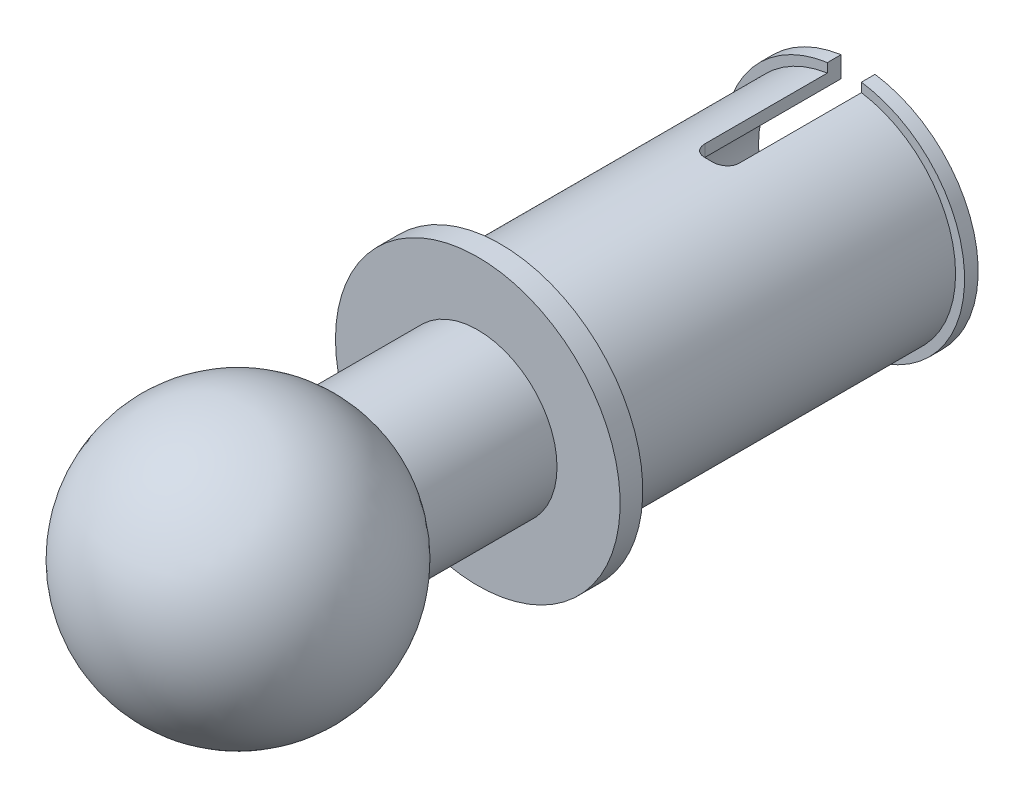
ISO-10303-21;
HEADER;
FILE_DESCRIPTION(('STEP AP214'),'2;1');
FILE_NAME('part.step','',(''),(''),'','','');
FILE_SCHEMA(('AUTOMOTIVE_DESIGN { 1 0 10303 214 1 1 1 1 }'));
ENDSEC;
DATA;
#1=APPLICATION_CONTEXT('core data for automotive mechanical design processes');
#2=APPLICATION_PROTOCOL_DEFINITION('international standard','automotive_design',2000,#1);
#3=PRODUCT_CONTEXT('',#1,'mechanical');
#4=PRODUCT('Part','Part','',(#3));
#5=PRODUCT_RELATED_PRODUCT_CATEGORY('part','',(#4));
#6=PRODUCT_DEFINITION_FORMATION('','',#4);
#7=PRODUCT_DEFINITION_CONTEXT('part definition',#1,'design');
#8=PRODUCT_DEFINITION('design','',#6,#7);
#9=PRODUCT_DEFINITION_SHAPE('','',#8);
#10=(LENGTH_UNIT() NAMED_UNIT(*) SI_UNIT(.MILLI.,.METRE.));
#11=(NAMED_UNIT(*) PLANE_ANGLE_UNIT() SI_UNIT($,.RADIAN.));
#12=(NAMED_UNIT(*) SI_UNIT($,.STERADIAN.) SOLID_ANGLE_UNIT());
#13=UNCERTAINTY_MEASURE_WITH_UNIT(LENGTH_MEASURE(1.E-05),#10,'distance_accuracy_value','');
#14=(GEOMETRIC_REPRESENTATION_CONTEXT(3) GLOBAL_UNCERTAINTY_ASSIGNED_CONTEXT((#13)) GLOBAL_UNIT_ASSIGNED_CONTEXT((#10,
#11,#12)) REPRESENTATION_CONTEXT('',''));
#15=CARTESIAN_POINT('',(0.,0.,0.));
#16=DIRECTION('',(0.,0.,1.));
#17=DIRECTION('',(1.,0.,0.));
#18=AXIS2_PLACEMENT_3D('',#15,#16,#17);
#19=CARTESIAN_POINT('',(0.,0.,3.));
#20=DIRECTION('',(0.,0.,-1.));
#21=DIRECTION('',(-1.,0.,0.));
#22=AXIS2_PLACEMENT_3D('',#19,#20,#21);
#23=CYLINDRICAL_SURFACE('',#22,1.75);
#24=CARTESIAN_POINT('',(0.,0.,0.));
#25=DIRECTION('',(0.,0.,1.));
#26=DIRECTION('',(1.,0.,0.));
#27=AXIS2_PLACEMENT_3D('',#24,#25,#26);
#28=CIRCLE('',#27,1.75);
#29=CARTESIAN_POINT('',(1.75,0.,0.));
#30=VERTEX_POINT('',#29);
#31=EDGE_CURVE('E50',#30,#30,#28,.T.);
#32=ORIENTED_EDGE('',*,*,#31,.T.);
#33=EDGE_LOOP('',(#32));
#34=FACE_BOUND('',#33,.T.);
#35=CARTESIAN_POINT('',(-1.23781172843719,-1.23706414112129,2.86587107800594));
#36=CARTESIAN_POINT('',(-1.16832295713658,-1.30658930635751,2.86613151653475));
#37=CARTESIAN_POINT('',(-1.09291087371414,-1.37029557879855,2.86637113637438));
#38=CARTESIAN_POINT('',(-0.932398448924122,-1.48419600156255,2.86679881320044));
#39=CARTESIAN_POINT('',(-0.847286539995932,-1.53437377337958,2.86698680769084));
#40=CARTESIAN_POINT('',(-0.669877838471443,-1.61970489632098,2.86730672753367));
#41=CARTESIAN_POINT('',(-0.577584495376744,-1.65486540875062,2.86743867961097));
#42=CARTESIAN_POINT('',(-0.388430053675515,-1.70918213712148,2.86764248770364));
#43=CARTESIAN_POINT('',(-0.291570098913812,-1.72834233855625,2.86771435868453));
#44=CARTESIAN_POINT('',(-0.0959978121947807,-1.75013306228772,2.86779610263345));
#45=CARTESIAN_POINT('',(0.00271470573638223,-1.75276191604778,2.86780596934329));
#46=CARTESIAN_POINT('',(0.199183795320416,-1.74140994510881,2.86776338115849));
#47=CARTESIAN_POINT('',(0.296940329011406,-1.72742846349632,2.86771092379904));
#48=CARTESIAN_POINT('',(0.488716547356107,-1.6832523003135,2.86754519083015));
#49=CARTESIAN_POINT('',(0.582736308214581,-1.65305794955787,2.86743191646167));
#50=CARTESIAN_POINT('',(0.764371933899558,-1.57731345076565,2.86714779129308));
#51=CARTESIAN_POINT('',(0.851987812222137,-1.53176333509222,2.86697694061432));
#52=CARTESIAN_POINT('',(1.01832919408176,-1.42660011383197,2.86658254531724));
#53=CARTESIAN_POINT('',(1.0970546549465,-1.36698694074939,2.86635900044602));
#54=CARTESIAN_POINT('',(1.24337985140612,-1.23539011138467,2.86586560634556));
#55=CARTESIAN_POINT('',(1.31097960636011,-1.16340647662801,2.86559575719691));
#56=CARTESIAN_POINT('',(1.43313507715094,-1.00911155637872,2.86501745304013));
#57=CARTESIAN_POINT('',(1.48769070831325,-0.92680020385011,2.86470899778142));
#58=CARTESIAN_POINT('',(1.58220880459615,-0.754186702892072,2.8640622795952));
#59=CARTESIAN_POINT('',(1.62217125388076,-0.663884545791449,2.86372401663534));
#60=CARTESIAN_POINT('',(1.68636875101415,-0.477852304805216,2.86302731257977));
#61=CARTESIAN_POINT('',(1.71060369856923,-0.38212218630993,2.86266887135541));
#62=CARTESIAN_POINT('',(1.74265785294353,-0.187952069242505,2.86194200987976));
#63=CARTESIAN_POINT('',(1.75047706589844,-0.089512071683247,2.8615735896322));
#64=CARTESIAN_POINT('',(1.74947781418076,0.107283886729034,2.86083723106276));
#65=CARTESIAN_POINT('',(1.74065927528938,0.205639847205221,2.86046929274304));
#66=CARTESIAN_POINT('',(1.70663469179721,0.399475269519153,2.85974433854194));
#67=CARTESIAN_POINT('',(1.68142864493993,0.494954730960815,2.85938732266207));
#68=CARTESIAN_POINT('',(1.61534454060295,0.680326751529844,2.85869432501763));
#69=CARTESIAN_POINT('',(1.57446648278764,0.770219310537567,2.85835834325353));
#70=CARTESIAN_POINT('',(1.47819873255001,0.941865699929958,2.85771692154179));
#71=CARTESIAN_POINT('',(1.42280904103219,1.02361953082191,2.85741148159224));
#72=CARTESIAN_POINT('',(1.29909060745432,1.17666733764984,2.85683977420972));
#73=CARTESIAN_POINT('',(1.23076191982931,1.24796135758857,2.85657350661195));
#74=CARTESIAN_POINT('',(1.08310496755828,1.37806606562148,2.85608766101448));
#75=CARTESIAN_POINT('',(1.00377670279522,1.43687675358284,2.85586808301528));
#76=CARTESIAN_POINT('',(0.836373052907074,1.54034491713454,2.85548180908152));
#77=CARTESIAN_POINT('',(0.748297725357388,1.5850024858762,2.85531511279889));
#78=CARTESIAN_POINT('',(0.565899730405491,1.65889718076986,2.85503930062829));
#79=CARTESIAN_POINT('',(0.471577064048076,1.68813430950074,2.85493018473069));
#80=CARTESIAN_POINT('',(0.279362560172519,1.73035800155919,2.85477260568945));
#81=CARTESIAN_POINT('',(0.181470745086311,1.74334466700205,2.85472414216467));
#82=CARTESIAN_POINT('',(-0.0151037822444458,1.75269910184221,2.85468923343177));
#83=CARTESIAN_POINT('',(-0.113786494791717,1.74906686487819,2.85470278824738));
#84=CARTESIAN_POINT('',(-0.309141185874032,1.72528662561853,2.85479153244129));
#85=CARTESIAN_POINT('',(-0.405813169768018,1.70513866734595,2.8548667216553));
#86=CARTESIAN_POINT('',(-0.594402347357204,1.64889903657181,2.85507661858788));
#87=CARTESIAN_POINT('',(-0.686319546080037,1.61280738092924,2.85521132624352));
#88=CARTESIAN_POINT('',(-0.862790130887985,1.5257048794776,2.85553646276093));
#89=CARTESIAN_POINT('',(-0.947343508981962,1.47469401747863,2.85572689168316));
#90=CARTESIAN_POINT('',(-1.10668631423175,1.35920109090994,2.85615810445742));
#91=CARTESIAN_POINT('',(-1.18147572344309,1.29471900158302,2.85639888840198));
#92=CARTESIAN_POINT('',(-1.31916765907599,1.15411391910872,2.85692401638699));
#93=CARTESIAN_POINT('',(-1.38207014519017,1.07799088648965,2.85720836057515));
#94=CARTESIAN_POINT('',(-1.4942024714582,0.916264822971578,2.8578125807027));
#95=CARTESIAN_POINT('',(-1.54343228418751,0.830661773058115,2.85813245671337));
#96=CARTESIAN_POINT('',(-1.62682277665568,0.652403582618012,2.85879870269929));
#97=CARTESIAN_POINT('',(-1.66098307387097,0.559748263147032,2.85914507334682));
#98=CARTESIAN_POINT('',(-1.71326182172136,0.370021269907531,2.85985448485442));
#99=CARTESIAN_POINT('',(-1.7313808994164,0.272949768925906,2.86021752506229));
#100=CARTESIAN_POINT('',(-1.75106480437168,0.0771529590822092,2.86094995961711));
#101=CARTESIAN_POINT('',(-1.75263127297451,-0.0215721848336674,2.86131935333041));
#102=CARTESIAN_POINT('',(-1.73916594381052,-0.217911001767462,2.86205414268293));
#103=CARTESIAN_POINT('',(-1.72413002626857,-0.31552439283729,2.86241953730708));
#104=CARTESIAN_POINT('',(-1.67787712307839,-0.506879013151351,2.86313601207493));
#105=CARTESIAN_POINT('',(-1.64665239163721,-0.600618365598762,2.86348708527951));
#106=CARTESIAN_POINT('',(-1.56892156096071,-0.781439590521581,2.86416434695263));
#107=CARTESIAN_POINT('',(-1.52243387904025,-0.868529331527148,2.86449056483165));
#108=CARTESIAN_POINT('',(-1.43563490174034,-1.00261406444327,2.86499317321039));
#109=CARTESIAN_POINT('',(-1.39954739134343,-1.05239530653383,2.86517986599321));
#110=CARTESIAN_POINT('',(-1.32234822555369,-1.14789654926951,2.86553744190864));
#111=CARTESIAN_POINT('',(-1.28123657360354,-1.19361655269744,2.86570832505209));
#112=CARTESIAN_POINT('',(-1.23781172843719,-1.23706414112129,2.86587107800594));
#113=B_SPLINE_CURVE_WITH_KNOTS('',3,(#35,#36,#37,#38,#39,#40,#41,#42,#43,#44,#45,#46,#47,#48,
#49,#50,#51,#52,#53,#54,#55,#56,#57,#58,#59,#60,#61,#62,#63,#64,#65,#66,#67,#68,#69,#70,#71,#72,
#73,#74,#75,#76,#77,#78,#79,#80,#81,#82,#83,#84,#85,#86,#87,#88,#89,#90,#91,#92,#93,#94,#95,#96,
#97,#98,#99,#100,#101,#102,#103,#104,#105,#106,#107,#108,#109,#110,#111,#112),.UNSPECIFIED.,.T.,
.F.,(4,2,2,2,2,2,2,2,2,2,2,2,2,2,2,2,2,2,2,2,2,2,2,2,2,2,2,2,2,2,2,2,2,2,2,2,2,2,4),(0.,
0.294670094103354,0.589695349671734,0.884579758550254,1.17939069318408,1.47423138310229,
1.76908373390866,2.063930068643,2.35877578197563,2.65362291045125,2.94846952587726,
3.24331805521642,3.53816690451331,3.83301763403201,4.12786825334477,4.42272018794983,
4.71757216315458,5.01242414467357,5.30727610781466,5.60212683052535,5.89697755637323,
6.19182634156722,6.48667507745128,6.78152196054404,7.07636895649723,7.37121516653095,
7.6660610647926,7.96090728301378,8.25575404310314,8.55060180297047,8.84545015423684,
9.14030598948322,9.43515029814664,9.72996537002543,10.0248536148079,10.3198830839027,
10.6145578507821,10.7987028822767,10.9828477875915),.UNSPECIFIED.);
#114=CARTESIAN_POINT('',(-1.23781172843719,-1.23706414112129,2.86587107800594));
#115=VERTEX_POINT('',#114);
#116=EDGE_CURVE('E11',#115,#115,#113,.T.);
#117=ORIENTED_EDGE('',*,*,#116,.F.);
#118=EDGE_LOOP('',(#117));
#119=FACE_BOUND('',#118,.T.);
#120=ADVANCED_FACE('F36',(#34,#119),#23,.T.);
#121=CARTESIAN_POINT('',(0.,0.,-8.4));
#122=DIRECTION('',(0.,0.,1.));
#123=DIRECTION('',(1.,0.,0.));
#124=AXIS2_PLACEMENT_3D('',#121,#122,#123);
#125=CYLINDRICAL_SURFACE('',#124,2.45588838636761);
#126=CARTESIAN_POINT('',(0.,0.,-0.5));
#127=DIRECTION('',(0.,0.,-1.));
#128=DIRECTION('',(-1.,0.,0.));
#129=AXIS2_PLACEMENT_3D('',#126,#127,#128);
#130=CIRCLE('',#129,2.45588838636761);
#131=CARTESIAN_POINT('',(-2.45588838636761,0.,-0.5));
#132=VERTEX_POINT('',#131);
#133=EDGE_CURVE('E191',#132,#132,#130,.T.);
#134=ORIENTED_EDGE('',*,*,#133,.T.);
#135=EDGE_LOOP('',(#134));
#136=FACE_BOUND('',#135,.T.);
#137=DIRECTION('',(0.,0.,1.));
#138=VECTOR('',#137,1.);
#139=CARTESIAN_POINT('',(-0.375484043586889,2.4270145239176,-8.4));
#140=LINE('',#139,#138);
#141=CARTESIAN_POINT('',(-0.375484043586889,2.4270145239176,-8.1));
#142=VERTEX_POINT('',#141);
#143=CARTESIAN_POINT('',(-0.375484043586889,2.4270145239176,-5.4));
#144=VERTEX_POINT('',#143);
#145=EDGE_CURVE('E359',#142,#144,#140,.T.);
#146=ORIENTED_EDGE('',*,*,#145,.F.);
#147=CARTESIAN_POINT('',(0.,0.,-8.1));
#148=DIRECTION('',(0.,0.,-1.));
#149=DIRECTION('',(-1.,0.,0.));
#150=AXIS2_PLACEMENT_3D('',#147,#148,#149);
#151=CIRCLE('',#150,2.45588838636761);
#152=CARTESIAN_POINT('',(-0.375484043586889,-2.4270145239176,-8.1));
#153=VERTEX_POINT('',#152);
#154=EDGE_CURVE('E194',#153,#142,#151,.T.);
#155=ORIENTED_EDGE('',*,*,#154,.F.);
#156=DIRECTION('',(0.,0.,1.));
#157=VECTOR('',#156,1.);
#158=CARTESIAN_POINT('',(-0.375484043586889,-2.4270145239176,-8.4));
#159=LINE('',#158,#157);
#160=CARTESIAN_POINT('',(-0.375484043586889,-2.4270145239176,-5.4));
#161=VERTEX_POINT('',#160);
#162=EDGE_CURVE('E344',#153,#161,#159,.T.);
#163=ORIENTED_EDGE('',*,*,#162,.T.);
#164=CARTESIAN_POINT('',(-0.375484043586889,-2.4270145239176,-5.4));
#165=CARTESIAN_POINT('',(-0.37549888169311,-2.42700727901654,-5.38323395709811));
#166=CARTESIAN_POINT('',(-0.374079480575116,-2.42723175515793,-5.36647423344671));
#167=CARTESIAN_POINT('',(-0.368484254202977,-2.42809008269441,-5.33345281186828));
#168=CARTESIAN_POINT('',(-0.364311881065487,-2.42872342137082,-5.31719051687422));
#169=CARTESIAN_POINT('',(-0.353320653464955,-2.4303458937768,-5.28560044550802));
#170=CARTESIAN_POINT('',(-0.346501028074678,-2.43133513114431,-5.27027294287008));
#171=CARTESIAN_POINT('',(-0.330419021984758,-2.43357291697825,-5.24098057187997));
#172=CARTESIAN_POINT('',(-0.32115667535512,-2.43482146182792,-5.22701568452637));
#173=CARTESIAN_POINT('',(-0.300375628953651,-2.4374725214059,-5.20073529663856));
#174=CARTESIAN_POINT('',(-0.288841538802671,-2.43887605593803,-5.18843206927226));
#175=CARTESIAN_POINT('',(-0.26387707030476,-2.44170313144287,-5.16592623819471));
#176=CARTESIAN_POINT('',(-0.250446291835951,-2.44312667657978,-5.15572407884016));
#177=CARTESIAN_POINT('',(-0.221959344739332,-2.44587976511667,-5.13764201250059));
#178=CARTESIAN_POINT('',(-0.206892273115667,-2.44720856617525,-5.12977917621617));
#179=CARTESIAN_POINT('',(-0.175636753863135,-2.44964987678169,-5.11670521278166));
#180=CARTESIAN_POINT('',(-0.159449021207576,-2.45076252254123,-5.11149241232325));
#181=CARTESIAN_POINT('',(-0.131887716717742,-2.45236950134714,-5.10513138616619));
#182=CARTESIAN_POINT('',(-0.120691498040775,-2.45294664732856,-5.1032091884432));
#183=CARTESIAN_POINT('',(-0.0981607316683699,-2.45395204366317,-5.10064339449119));
#184=CARTESIAN_POINT('',(-0.0868263672836446,-2.45438047292502,-5.09999825751019));
#185=CARTESIAN_POINT('',(-0.0754840435868893,-2.45472807566522,-5.1));
#186=B_SPLINE_CURVE_WITH_KNOTS('',3,(#164,#165,#166,#167,#168,#169,#170,#171,#172,#173,#174,
#175,#176,#177,#178,#179,#180,#181,#182,#183,#184,#185),.UNSPECIFIED.,.F.,.F.,(4,2,2,2,2,2,2,2,
2,2,4),(0.,0.0502272334882759,0.100391603431723,0.150570593110447,0.2007488829516,
0.251279595061836,0.301820983006515,0.352722616251689,0.403592068705982,0.437647065288577,
0.471660949996417),.UNSPECIFIED.);
#187=CARTESIAN_POINT('',(-0.0754840435868895,-2.45472807566522,-5.1));
#188=VERTEX_POINT('',#187);
#189=EDGE_CURVE('E231',#161,#188,#186,.T.);
#190=ORIENTED_EDGE('',*,*,#189,.T.);
#191=CARTESIAN_POINT('',(0.,0.,-5.1));
#192=DIRECTION('',(0.,0.,-1.));
#193=DIRECTION('',(-1.,0.,0.));
#194=AXIS2_PLACEMENT_3D('',#191,#192,#193);
#195=CIRCLE('',#194,2.45588838636761);
#196=CARTESIAN_POINT('',(0.0754840435868895,-2.45472807566522,-5.1));
#197=VERTEX_POINT('',#196);
#198=EDGE_CURVE('E321',#197,#188,#195,.T.);
#199=ORIENTED_EDGE('',*,*,#198,.F.);
#200=CARTESIAN_POINT('',(0.0754840435868895,-2.45472807566522,-5.1));
#201=CARTESIAN_POINT('',(0.0923420988839594,-2.45421630633497,-5.09998562797421));
#202=CARTESIAN_POINT('',(0.109187924016877,-2.45351803612839,-5.10142003308527));
#203=CARTESIAN_POINT('',(0.142371089634653,-2.45181265088135,-5.10707217215756));
#204=CARTESIAN_POINT('',(0.158708987042475,-2.45080588826574,-5.11128673633791));
#205=CARTESIAN_POINT('',(0.190437262866639,-2.44854590180302,-5.12238701827945));
#206=CARTESIAN_POINT('',(0.205827371164301,-2.44729260811778,-5.12927349348699));
#207=CARTESIAN_POINT('',(0.235230006652533,-2.44464151410403,-5.14551397480055));
#208=CARTESIAN_POINT('',(0.24924257828844,-2.44324371844078,-5.15486790125994));
#209=CARTESIAN_POINT('',(0.275582178616159,-2.44041372767217,-5.1758441270666));
#210=CARTESIAN_POINT('',(0.287899054638753,-2.43898138100939,-5.18747915737625));
#211=CARTESIAN_POINT('',(0.310409816539773,-2.43621887744776,-5.21266308922253));
#212=CARTESIAN_POINT('',(0.320603316459189,-2.43488873915467,-5.22621233795046));
#213=CARTESIAN_POINT('',(0.338588357530534,-2.43245318466727,-5.25486951128836));
#214=CARTESIAN_POINT('',(0.346375947157327,-2.43134813917403,-5.26997994629307));
#215=CARTESIAN_POINT('',(0.359292591821828,-2.42947308607119,-5.3013119223987));
#216=CARTESIAN_POINT('',(0.36442346713599,-2.42870284912214,-5.3175326940902));
#217=CARTESIAN_POINT('',(0.370585562803578,-2.42776855612038,-5.3448799334876));
#218=CARTESIAN_POINT('',(0.372420949037788,-2.42748698007668,-5.35582788993223));
#219=CARTESIAN_POINT('',(0.374870230998934,-2.42710949830464,-5.3778488965225));
#220=CARTESIAN_POINT('',(0.37548564181925,-2.42701336228145,-5.38892177430955));
#221=CARTESIAN_POINT('',(0.375484043586889,-2.4270145239176,-5.4));
#222=B_SPLINE_CURVE_WITH_KNOTS('',3,(#200,#201,#202,#203,#204,#205,#206,#207,#208,#209,#210,
#211,#212,#213,#214,#215,#216,#217,#218,#219,#220,#221),.UNSPECIFIED.,.F.,.F.,(4,2,2,2,2,2,2,2,
2,2,4),(0.,0.0505260721160713,0.100994636586164,0.151477518596309,0.201958771273612,
0.252730222994284,0.303510895235536,0.354374532842476,0.405203274410755,0.438451454147828,
0.471658316876831),.UNSPECIFIED.);
#223=CARTESIAN_POINT('',(0.375484043586889,-2.4270145239176,-5.4));
#224=VERTEX_POINT('',#223);
#225=EDGE_CURVE('E265',#197,#224,#222,.T.);
#226=ORIENTED_EDGE('',*,*,#225,.T.);
#227=DIRECTION('',(0.,0.,1.));
#228=VECTOR('',#227,1.);
#229=CARTESIAN_POINT('',(0.375484043586889,-2.4270145239176,-8.4));
#230=LINE('',#229,#228);
#231=CARTESIAN_POINT('',(0.375484043586889,-2.4270145239176,-8.1));
#232=VERTEX_POINT('',#231);
#233=EDGE_CURVE('E349',#232,#224,#230,.T.);
#234=ORIENTED_EDGE('',*,*,#233,.F.);
#235=CARTESIAN_POINT('',(0.375484043586889,2.4270145239176,-8.1));
#236=VERTEX_POINT('',#235);
#237=EDGE_CURVE('E203',#236,#232,#151,.T.);
#238=ORIENTED_EDGE('',*,*,#237,.F.);
#239=DIRECTION('',(0.,0.,1.));
#240=VECTOR('',#239,1.);
#241=CARTESIAN_POINT('',(0.375484043586889,2.4270145239176,-8.4));
#242=LINE('',#241,#240);
#243=CARTESIAN_POINT('',(0.375484043586889,2.4270145239176,-5.4));
#244=VERTEX_POINT('',#243);
#245=EDGE_CURVE('E355',#236,#244,#242,.T.);
#246=ORIENTED_EDGE('',*,*,#245,.T.);
#247=CARTESIAN_POINT('',(0.375484043586889,2.4270145239176,-5.4));
#248=CARTESIAN_POINT('',(0.37549888169311,2.42700727901654,-5.38323395709811));
#249=CARTESIAN_POINT('',(0.374079480575116,2.42723175515793,-5.36647423344671));
#250=CARTESIAN_POINT('',(0.368484254202977,2.42809008269441,-5.33345281186828));
#251=CARTESIAN_POINT('',(0.364311881065487,2.42872342137082,-5.31719051687422));
#252=CARTESIAN_POINT('',(0.353320653464955,2.4303458937768,-5.28560044550802));
#253=CARTESIAN_POINT('',(0.346501028074678,2.43133513114431,-5.27027294287008));
#254=CARTESIAN_POINT('',(0.330419021984758,2.43357291697825,-5.24098057187997));
#255=CARTESIAN_POINT('',(0.32115667535512,2.43482146182792,-5.22701568452637));
#256=CARTESIAN_POINT('',(0.300375628953651,2.4374725214059,-5.20073529663856));
#257=CARTESIAN_POINT('',(0.288841538802671,2.43887605593803,-5.18843206927226));
#258=CARTESIAN_POINT('',(0.26387707030476,2.44170313144287,-5.16592623819471));
#259=CARTESIAN_POINT('',(0.250446291835951,2.44312667657978,-5.15572407884016));
#260=CARTESIAN_POINT('',(0.221959344739332,2.44587976511667,-5.13764201250059));
#261=CARTESIAN_POINT('',(0.206892273115667,2.44720856617525,-5.12977917621617));
#262=CARTESIAN_POINT('',(0.175636753863135,2.44964987678169,-5.11670521278166));
#263=CARTESIAN_POINT('',(0.159449021207576,2.45076252254123,-5.11149241232325));
#264=CARTESIAN_POINT('',(0.131887716717742,2.45236950134714,-5.10513138616619));
#265=CARTESIAN_POINT('',(0.120691498040775,2.45294664732856,-5.1032091884432));
#266=CARTESIAN_POINT('',(0.0981607316683699,2.45395204366317,-5.10064339449119));
#267=CARTESIAN_POINT('',(0.0868263672836446,2.45438047292502,-5.09999825751019));
#268=CARTESIAN_POINT('',(0.0754840435868893,2.45472807566522,-5.1));
#269=B_SPLINE_CURVE_WITH_KNOTS('',3,(#247,#248,#249,#250,#251,#252,#253,#254,#255,#256,#257,
#258,#259,#260,#261,#262,#263,#264,#265,#266,#267,#268),.UNSPECIFIED.,.F.,.F.,(4,2,2,2,2,2,2,2,
2,2,4),(0.,0.0502272334882759,0.100391603431723,0.150570593110447,0.2007488829516,
0.251279595061836,0.301820983006515,0.352722616251689,0.403592068705982,0.437647065288577,
0.471660949996417),.UNSPECIFIED.);
#270=CARTESIAN_POINT('',(0.0754840435868895,2.45472807566522,-5.1));
#271=VERTEX_POINT('',#270);
#272=EDGE_CURVE('E300',#244,#271,#269,.T.);
#273=ORIENTED_EDGE('',*,*,#272,.T.);
#274=CARTESIAN_POINT('',(0.,0.,-5.1));
#275=DIRECTION('',(0.,0.,-1.));
#276=DIRECTION('',(-1.,0.,0.));
#277=AXIS2_PLACEMENT_3D('',#274,#275,#276);
#278=CIRCLE('',#277,2.45588838636761);
#279=CARTESIAN_POINT('',(-0.0754840435868895,2.45472807566522,-5.1));
#280=VERTEX_POINT('',#279);
#281=EDGE_CURVE('E352',#280,#271,#278,.T.);
#282=ORIENTED_EDGE('',*,*,#281,.F.);
#283=CARTESIAN_POINT('',(-0.0754840435868895,2.45472807566522,-5.1));
#284=CARTESIAN_POINT('',(-0.0923420988839594,2.45421630633497,-5.09998562797421));
#285=CARTESIAN_POINT('',(-0.109187924016877,2.45351803612839,-5.10142003308527));
#286=CARTESIAN_POINT('',(-0.142371089634653,2.45181265088135,-5.10707217215756));
#287=CARTESIAN_POINT('',(-0.158708987042475,2.45080588826574,-5.11128673633791));
#288=CARTESIAN_POINT('',(-0.190437262866639,2.44854590180302,-5.12238701827945));
#289=CARTESIAN_POINT('',(-0.205827371164301,2.44729260811778,-5.12927349348699));
#290=CARTESIAN_POINT('',(-0.235230006652533,2.44464151410403,-5.14551397480055));
#291=CARTESIAN_POINT('',(-0.24924257828844,2.44324371844078,-5.15486790125994));
#292=CARTESIAN_POINT('',(-0.275582178616159,2.44041372767217,-5.1758441270666));
#293=CARTESIAN_POINT('',(-0.287899054638753,2.43898138100939,-5.18747915737625));
#294=CARTESIAN_POINT('',(-0.310409816539773,2.43621887744776,-5.21266308922253));
#295=CARTESIAN_POINT('',(-0.320603316459189,2.43488873915467,-5.22621233795046));
#296=CARTESIAN_POINT('',(-0.338588357530534,2.43245318466727,-5.25486951128836));
#297=CARTESIAN_POINT('',(-0.346375947157327,2.43134813917403,-5.26997994629307));
#298=CARTESIAN_POINT('',(-0.359292591821828,2.42947308607119,-5.3013119223987));
#299=CARTESIAN_POINT('',(-0.36442346713599,2.42870284912214,-5.3175326940902));
#300=CARTESIAN_POINT('',(-0.370585562803578,2.42776855612038,-5.3448799334876));
#301=CARTESIAN_POINT('',(-0.372420949037788,2.42748698007668,-5.35582788993223));
#302=CARTESIAN_POINT('',(-0.374870230998934,2.42710949830464,-5.3778488965225));
#303=CARTESIAN_POINT('',(-0.37548564181925,2.42701336228145,-5.38892177430955));
#304=CARTESIAN_POINT('',(-0.375484043586889,2.4270145239176,-5.4));
#305=B_SPLINE_CURVE_WITH_KNOTS('',3,(#283,#284,#285,#286,#287,#288,#289,#290,#291,#292,#293,
#294,#295,#296,#297,#298,#299,#300,#301,#302,#303,#304),.UNSPECIFIED.,.F.,.F.,(4,2,2,2,2,2,2,2,
2,2,4),(0.,0.0505260721160713,0.100994636586164,0.151477518596309,0.201958771273612,
0.252730222994284,0.303510895235536,0.354374532842476,0.405203274410755,0.438451454147828,
0.471658316876831),.UNSPECIFIED.);
#306=EDGE_CURVE('E290',#280,#144,#305,.T.);
#307=ORIENTED_EDGE('',*,*,#306,.T.);
#308=EDGE_LOOP('',(#146,#155,#163,#190,#199,#226,#234,#238,#246,#273,#282,#307));
#309=FACE_BOUND('',#308,.T.);
#310=ADVANCED_FACE('F277',(#136,#309),#125,.T.);
#311=CARTESIAN_POINT('',(0.,0.,-8.1));
#312=DIRECTION('',(0.,0.,-1.));
#313=DIRECTION('',(-1.,0.,0.));
#314=AXIS2_PLACEMENT_3D('',#311,#312,#313);
#315=CYLINDRICAL_SURFACE('',#314,2.65462564964279);
#316=CARTESIAN_POINT('',(0.,0.,-8.1));
#317=DIRECTION('',(0.,0.,-1.));
#318=DIRECTION('',(-1.,0.,0.));
#319=AXIS2_PLACEMENT_3D('',#316,#317,#318);
#320=CIRCLE('',#319,2.65462564964279);
#321=CARTESIAN_POINT('',(-0.375484043586889,-2.62793627638744,-8.1));
#322=VERTEX_POINT('',#321);
#323=CARTESIAN_POINT('',(-0.375484043586889,2.62793627638744,-8.1));
#324=VERTEX_POINT('',#323);
#325=EDGE_CURVE('E181',#322,#324,#320,.T.);
#326=ORIENTED_EDGE('',*,*,#325,.T.);
#327=DIRECTION('',(0.,0.,-1.));
#328=VECTOR('',#327,1.);
#329=CARTESIAN_POINT('',(-0.375484043586889,2.62793627638744,-5.1));
#330=LINE('',#329,#328);
#331=CARTESIAN_POINT('',(-0.375484043586889,2.62793627638744,-8.4));
#332=VERTEX_POINT('',#331);
#333=EDGE_CURVE('E318',#324,#332,#330,.T.);
#334=ORIENTED_EDGE('',*,*,#333,.T.);
#335=CARTESIAN_POINT('',(0.,0.,-8.4));
#336=DIRECTION('',(0.,0.,-1.));
#337=DIRECTION('',(-1.,0.,0.));
#338=AXIS2_PLACEMENT_3D('',#335,#336,#337);
#339=CIRCLE('',#338,2.65462564964279);
#340=CARTESIAN_POINT('',(-0.375484043586889,-2.62793627638744,-8.4));
#341=VERTEX_POINT('',#340);
#342=EDGE_CURVE('E182',#341,#332,#339,.T.);
#343=ORIENTED_EDGE('',*,*,#342,.F.);
#344=DIRECTION('',(0.,0.,-1.));
#345=VECTOR('',#344,1.);
#346=CARTESIAN_POINT('',(-0.375484043586889,-2.62793627638744,-5.1));
#347=LINE('',#346,#345);
#348=EDGE_CURVE('E336',#322,#341,#347,.T.);
#349=ORIENTED_EDGE('',*,*,#348,.F.);
#350=EDGE_LOOP('',(#326,#334,#343,#349));
#351=FACE_BOUND('',#350,.T.);
#352=ADVANCED_FACE('F282',(#351),#315,.T.);
#353=DIRECTION('',(0.,0.,-1.));
#354=VECTOR('',#353,1.);
#355=CARTESIAN_POINT('',(0.375484043586889,2.62793627638744,-5.1));
#356=LINE('',#355,#354);
#357=CARTESIAN_POINT('',(0.375484043586889,2.62793627638744,-8.1));
#358=VERTEX_POINT('',#357);
#359=CARTESIAN_POINT('',(0.375484043586889,2.62793627638744,-8.4));
#360=VERTEX_POINT('',#359);
#361=EDGE_CURVE('E154',#358,#360,#356,.T.);
#362=ORIENTED_EDGE('',*,*,#361,.F.);
#363=CARTESIAN_POINT('',(0.375484043586889,-2.62793627638744,-8.1));
#364=VERTEX_POINT('',#363);
#365=EDGE_CURVE('E185',#358,#364,#320,.T.);
#366=ORIENTED_EDGE('',*,*,#365,.T.);
#367=DIRECTION('',(0.,0.,-1.));
#368=VECTOR('',#367,1.);
#369=CARTESIAN_POINT('',(0.375484043586889,-2.62793627638744,-5.1));
#370=LINE('',#369,#368);
#371=CARTESIAN_POINT('',(0.375484043586889,-2.62793627638744,-8.4));
#372=VERTEX_POINT('',#371);
#373=EDGE_CURVE('E180',#364,#372,#370,.T.);
#374=ORIENTED_EDGE('',*,*,#373,.T.);
#375=EDGE_CURVE('E172',#360,#372,#339,.T.);
#376=ORIENTED_EDGE('',*,*,#375,.F.);
#377=EDGE_LOOP('',(#362,#366,#374,#376));
#378=FACE_BOUND('',#377,.T.);
#379=ADVANCED_FACE('F179',(#378),#315,.T.);
#380=CARTESIAN_POINT('',(0.,0.,-8.1));
#381=DIRECTION('',(0.,0.,-1.));
#382=DIRECTION('',(-1.,0.,0.));
#383=AXIS2_PLACEMENT_3D('',#380,#381,#382);
#384=PLANE('',#383);
#385=DIRECTION('',(0.,-1.,0.));
#386=VECTOR('',#385,1.);
#387=CARTESIAN_POINT('',(-0.375484043586889,0.,-8.1));
#388=LINE('',#387,#386);
#389=EDGE_CURVE('E357',#324,#142,#388,.T.);
#390=ORIENTED_EDGE('',*,*,#389,.F.);
#391=ORIENTED_EDGE('',*,*,#325,.F.);
#392=DIRECTION('',(0.,1.,0.));
#393=VECTOR('',#392,1.);
#394=CARTESIAN_POINT('',(-0.375484043586889,0.,-8.1));
#395=LINE('',#394,#393);
#396=EDGE_CURVE('E341',#322,#153,#395,.T.);
#397=ORIENTED_EDGE('',*,*,#396,.T.);
#398=ORIENTED_EDGE('',*,*,#154,.T.);
#399=EDGE_LOOP('',(#390,#391,#397,#398));
#400=FACE_BOUND('',#399,.T.);
#401=ADVANCED_FACE('F382',(#400),#384,.F.);
#402=ORIENTED_EDGE('',*,*,#365,.F.);
#403=DIRECTION('',(0.,-1.,0.));
#404=VECTOR('',#403,1.);
#405=CARTESIAN_POINT('',(0.375484043586889,0.,-8.1));
#406=LINE('',#405,#404);
#407=EDGE_CURVE('E160',#358,#236,#406,.T.);
#408=ORIENTED_EDGE('',*,*,#407,.T.);
#409=ORIENTED_EDGE('',*,*,#237,.T.);
#410=DIRECTION('',(0.,1.,0.));
#411=VECTOR('',#410,1.);
#412=CARTESIAN_POINT('',(0.375484043586889,0.,-8.1));
#413=LINE('',#412,#411);
#414=EDGE_CURVE('E347',#364,#232,#413,.T.);
#415=ORIENTED_EDGE('',*,*,#414,.F.);
#416=EDGE_LOOP('',(#402,#408,#409,#415));
#417=FACE_BOUND('',#416,.T.);
#418=ADVANCED_FACE('F410',(#417),#384,.F.);
#419=CARTESIAN_POINT('',(0.,0.,-8.4));
#420=DIRECTION('',(0.,0.,-1.));
#421=DIRECTION('',(-1.,0.,0.));
#422=AXIS2_PLACEMENT_3D('',#419,#420,#421);
#423=PLANE('',#422);
#424=ORIENTED_EDGE('',*,*,#342,.T.);
#425=DIRECTION('',(0.,-1.,0.));
#426=VECTOR('',#425,1.);
#427=CARTESIAN_POINT('',(-0.375484043586889,0.,-8.4));
#428=LINE('',#427,#426);
#429=CARTESIAN_POINT('',(-0.375484043586889,2.16630363823869,-8.4));
#430=VERTEX_POINT('',#429);
#431=EDGE_CURVE('E175',#332,#430,#428,.T.);
#432=ORIENTED_EDGE('',*,*,#431,.T.);
#433=CARTESIAN_POINT('',(0.,0.,-8.4));
#434=DIRECTION('',(0.,0.,-1.));
#435=DIRECTION('',(-1.,0.,0.));
#436=AXIS2_PLACEMENT_3D('',#433,#434,#435);
#437=CIRCLE('',#436,2.19860403893801);
#438=CARTESIAN_POINT('',(-0.375484043586889,-2.16630363823869,-8.4));
#439=VERTEX_POINT('',#438);
#440=EDGE_CURVE('E362',#439,#430,#437,.T.);
#441=ORIENTED_EDGE('',*,*,#440,.F.);
#442=DIRECTION('',(0.,1.,0.));
#443=VECTOR('',#442,1.);
#444=CARTESIAN_POINT('',(-0.375484043586889,0.,-8.4));
#445=LINE('',#444,#443);
#446=EDGE_CURVE('E328',#341,#439,#445,.T.);
#447=ORIENTED_EDGE('',*,*,#446,.F.);
#448=EDGE_LOOP('',(#424,#432,#441,#447));
#449=FACE_BOUND('',#448,.T.);
#450=ADVANCED_FACE('F284',(#449),#423,.T.);
#451=DIRECTION('',(0.,-1.,0.));
#452=VECTOR('',#451,1.);
#453=CARTESIAN_POINT('',(0.375484043586889,0.,-8.4));
#454=LINE('',#453,#452);
#455=CARTESIAN_POINT('',(0.375484043586889,2.16630363823869,-8.4));
#456=VERTEX_POINT('',#455);
#457=EDGE_CURVE('E157',#360,#456,#454,.T.);
#458=ORIENTED_EDGE('',*,*,#457,.F.);
#459=ORIENTED_EDGE('',*,*,#375,.T.);
#460=DIRECTION('',(0.,1.,0.));
#461=VECTOR('',#460,1.);
#462=CARTESIAN_POINT('',(0.375484043586889,0.,-8.4));
#463=LINE('',#462,#461);
#464=CARTESIAN_POINT('',(0.375484043586889,-2.16630363823869,-8.4));
#465=VERTEX_POINT('',#464);
#466=EDGE_CURVE('E329',#372,#465,#463,.T.);
#467=ORIENTED_EDGE('',*,*,#466,.T.);
#468=EDGE_CURVE('E174',#456,#465,#437,.T.);
#469=ORIENTED_EDGE('',*,*,#468,.F.);
#470=EDGE_LOOP('',(#458,#459,#467,#469));
#471=FACE_BOUND('',#470,.T.);
#472=ADVANCED_FACE('F170',(#471),#423,.T.);
#473=CARTESIAN_POINT('',(0.,0.,5.7185913003088));
#474=DIRECTION('',(0.,0.,-1.));
#475=DIRECTION('',(-1.,0.,0.));
#476=AXIS2_PLACEMENT_3D('',#473,#474,#475);
#477=CYLINDRICAL_SURFACE('',#476,2.19860403893801);
#478=CARTESIAN_POINT('',(0.,0.,-0.5));
#479=DIRECTION('',(0.,0.,-1.));
#480=DIRECTION('',(-1.,0.,0.));
#481=AXIS2_PLACEMENT_3D('',#478,#479,#480);
#482=CIRCLE('',#481,2.19860403893801);
#483=CARTESIAN_POINT('',(-2.19860403893801,0.,-0.5));
#484=VERTEX_POINT('',#483);
#485=EDGE_CURVE('E188',#484,#484,#482,.F.);
#486=ORIENTED_EDGE('',*,*,#485,.T.);
#487=EDGE_LOOP('',(#486));
#488=FACE_BOUND('',#487,.T.);
#489=DIRECTION('',(0.,0.,-1.));
#490=VECTOR('',#489,1.);
#491=CARTESIAN_POINT('',(-0.375484043586889,2.16630363823869,-5.1));
#492=LINE('',#491,#490);
#493=CARTESIAN_POINT('',(-0.375484043586889,2.16630363823869,-5.4));
#494=VERTEX_POINT('',#493);
#495=EDGE_CURVE('E322',#494,#430,#492,.T.);
#496=ORIENTED_EDGE('',*,*,#495,.F.);
#497=CARTESIAN_POINT('',(-0.375484043586889,2.16630363823869,-5.4));
#498=CARTESIAN_POINT('',(-0.375499004030253,2.1662955182539,-5.38326169391637));
#499=CARTESIAN_POINT('',(-0.37408414660384,2.16654620821502,-5.36653021722232));
#500=CARTESIAN_POINT('',(-0.3685083860011,2.16750445985729,-5.33356721625406));
#501=CARTESIAN_POINT('',(-0.364351238920216,2.16821139659173,-5.31733503987572));
#502=CARTESIAN_POINT('',(-0.353402589019536,2.17002192143631,-5.28580479549862));
#503=CARTESIAN_POINT('',(-0.346610443383168,2.17112560632963,-5.27050695648936));
#504=CARTESIAN_POINT('',(-0.330595740339423,2.17362187432035,-5.24126836424289));
#505=CARTESIAN_POINT('',(-0.321373120453298,2.17501446484428,-5.22732764590498));
#506=CARTESIAN_POINT('',(-0.300664544049281,2.17797393678878,-5.20106304911403));
#507=CARTESIAN_POINT('',(-0.289159444292936,2.17954223985445,-5.18875442532652));
#508=CARTESIAN_POINT('',(-0.264253762463789,2.18270175867593,-5.16623105162575));
#509=CARTESIAN_POINT('',(-0.25085277246763,2.18429297929638,-5.15601675349307));
#510=CARTESIAN_POINT('',(-0.222397507524555,2.18737410143076,-5.13788620854756));
#511=CARTESIAN_POINT('',(-0.207329601143302,2.18886297711613,-5.12999118612127));
#512=CARTESIAN_POINT('',(-0.17606248288715,2.19159925782312,-5.11685505029518));
#513=CARTESIAN_POINT('',(-0.159864005782446,2.19284681772608,-5.11161223114364));
#514=CARTESIAN_POINT('',(-0.132226004948066,2.19465264407049,-5.10519375099219));
#515=CARTESIAN_POINT('',(-0.120965236208155,2.19530284717759,-5.10324842901042));
#516=CARTESIAN_POINT('',(-0.0983004575159638,2.19643501301636,-5.10065138092411));
#517=CARTESIAN_POINT('',(-0.0868966274254147,2.1969171686031,-5.09999816791299));
#518=CARTESIAN_POINT('',(-0.0754840435868895,2.19730787082701,-5.1));
#519=B_SPLINE_CURVE_WITH_KNOTS('',3,(#497,#498,#499,#500,#501,#502,#503,#504,#505,#506,#507,
#508,#509,#510,#511,#512,#513,#514,#515,#516,#517,#518),.UNSPECIFIED.,.F.,.F.,(4,2,2,2,2,2,2,2,
2,2,4),(0.,0.050143111795553,0.100217685123882,0.15030448199872,0.200392566550498,
0.250919997837291,0.301458317283534,0.352445666659585,0.40340018194375,0.437667752649695,
0.471895866631565),.UNSPECIFIED.);
#520=CARTESIAN_POINT('',(-0.0754840435868895,2.19730787082701,-5.1));
#521=VERTEX_POINT('',#520);
#522=EDGE_CURVE('E271',#494,#521,#519,.T.);
#523=ORIENTED_EDGE('',*,*,#522,.T.);
#524=CARTESIAN_POINT('',(0.,0.,-5.1));
#525=DIRECTION('',(0.,0.,-1.));
#526=DIRECTION('',(-1.,0.,0.));
#527=AXIS2_PLACEMENT_3D('',#524,#525,#526);
#528=CIRCLE('',#527,2.19860403893801);
#529=CARTESIAN_POINT('',(0.0754840435868895,2.19730787082701,-5.1));
#530=VERTEX_POINT('',#529);
#531=EDGE_CURVE('E166',#530,#521,#528,.F.);
#532=ORIENTED_EDGE('',*,*,#531,.F.);
#533=CARTESIAN_POINT('',(0.0754840435868895,2.19730787082701,-5.1));
#534=CARTESIAN_POINT('',(0.0923371731147178,2.19673629179559,-5.09998561829498));
#535=CARTESIAN_POINT('',(0.109176113697559,2.19595654805753,-5.10141918335696));
#536=CARTESIAN_POINT('',(0.142341011292237,2.19405234014884,-5.10706589947618));
#537=CARTESIAN_POINT('',(0.158667571533368,2.19292829949944,-5.11127564283854));
#538=CARTESIAN_POINT('',(0.190370407583456,2.19040506342303,-5.12236023556258));
#539=CARTESIAN_POINT('',(0.205746458518446,2.1890058032088,-5.12923571281393));
#540=CARTESIAN_POINT('',(0.235122830694057,2.18604541379457,-5.14544791293007));
#541=CARTESIAN_POINT('',(0.249123148192526,2.18448428415429,-5.1547846424895));
#542=CARTESIAN_POINT('',(0.275461894960524,2.18132027266677,-5.17573651310319));
#543=CARTESIAN_POINT('',(0.287787679991331,2.17971717162115,-5.18736752046101));
#544=CARTESIAN_POINT('',(0.310317510174264,2.17662407555668,-5.21254697478179));
#545=CARTESIAN_POINT('',(0.320521174569201,2.1751341008657,-5.22609576510744));
#546=CARTESIAN_POINT('',(0.338531030576599,2.17240417644626,-5.25476393560007));
#547=CARTESIAN_POINT('',(0.34633228753712,2.17116474311051,-5.26988646422059));
#548=CARTESIAN_POINT('',(0.359272206739307,2.16906119381881,-5.30125013433825));
#549=CARTESIAN_POINT('',(0.36441276203219,2.16819681109071,-5.31749047118415));
#550=CARTESIAN_POINT('',(0.370582264457142,2.16714895727266,-5.34486184153094));
#551=CARTESIAN_POINT('',(0.372418774124025,2.16683331856403,-5.35581253487506));
#552=CARTESIAN_POINT('',(0.374869757967432,2.16641012494144,-5.37784044789296));
#553=CARTESIAN_POINT('',(0.375485690947252,2.16630232163189,-5.38891750059278));
#554=CARTESIAN_POINT('',(0.375484043586889,2.16630363823869,-5.4));
#555=B_SPLINE_CURVE_WITH_KNOTS('',3,(#533,#534,#535,#536,#537,#538,#539,#540,#541,#542,#543,
#544,#545,#546,#547,#548,#549,#550,#551,#552,#553,#554),.UNSPECIFIED.,.F.,.F.,(4,2,2,2,2,2,2,2,
2,2,4),(0.,0.0505160539457946,0.100970215728338,0.151436268762187,0.201902459065665,
0.252730729264511,0.303568111369872,0.354509229744971,0.405414054247826,0.438673216064906,
0.471892603316254),.UNSPECIFIED.);
#556=CARTESIAN_POINT('',(0.375484043586889,2.16630363823869,-5.4));
#557=VERTEX_POINT('',#556);
#558=EDGE_CURVE('E65',#530,#557,#555,.T.);
#559=ORIENTED_EDGE('',*,*,#558,.T.);
#560=DIRECTION('',(0.,0.,-1.));
#561=VECTOR('',#560,1.);
#562=CARTESIAN_POINT('',(0.375484043586889,2.16630363823869,-5.1));
#563=LINE('',#562,#561);
#564=EDGE_CURVE('E165',#557,#456,#563,.T.);
#565=ORIENTED_EDGE('',*,*,#564,.T.);
#566=ORIENTED_EDGE('',*,*,#468,.T.);
#567=DIRECTION('',(0.,0.,-1.));
#568=VECTOR('',#567,1.);
#569=CARTESIAN_POINT('',(0.375484043586889,-2.16630363823869,-5.1));
#570=LINE('',#569,#568);
#571=CARTESIAN_POINT('',(0.375484043586889,-2.16630363823869,-5.4));
#572=VERTEX_POINT('',#571);
#573=EDGE_CURVE('E176',#572,#465,#570,.T.);
#574=ORIENTED_EDGE('',*,*,#573,.F.);
#575=CARTESIAN_POINT('',(0.375484043586889,-2.16630363823869,-5.4));
#576=CARTESIAN_POINT('',(0.375499004030253,-2.1662955182539,-5.38326169391637));
#577=CARTESIAN_POINT('',(0.37408414660384,-2.16654620821502,-5.36653021722232));
#578=CARTESIAN_POINT('',(0.3685083860011,-2.16750445985729,-5.33356721625406));
#579=CARTESIAN_POINT('',(0.364351238920216,-2.16821139659173,-5.31733503987572));
#580=CARTESIAN_POINT('',(0.353402589019536,-2.17002192143631,-5.28580479549862));
#581=CARTESIAN_POINT('',(0.346610443383168,-2.17112560632963,-5.27050695648936));
#582=CARTESIAN_POINT('',(0.330595740339423,-2.17362187432035,-5.24126836424289));
#583=CARTESIAN_POINT('',(0.321373120453298,-2.17501446484428,-5.22732764590498));
#584=CARTESIAN_POINT('',(0.300664544049281,-2.17797393678878,-5.20106304911403));
#585=CARTESIAN_POINT('',(0.289159444292936,-2.17954223985445,-5.18875442532652));
#586=CARTESIAN_POINT('',(0.264253762463789,-2.18270175867593,-5.16623105162575));
#587=CARTESIAN_POINT('',(0.25085277246763,-2.18429297929638,-5.15601675349307));
#588=CARTESIAN_POINT('',(0.222397507524555,-2.18737410143076,-5.13788620854756));
#589=CARTESIAN_POINT('',(0.207329601143302,-2.18886297711613,-5.12999118612127));
#590=CARTESIAN_POINT('',(0.17606248288715,-2.19159925782312,-5.11685505029518));
#591=CARTESIAN_POINT('',(0.159864005782446,-2.19284681772608,-5.11161223114364));
#592=CARTESIAN_POINT('',(0.132226004948066,-2.19465264407049,-5.10519375099219));
#593=CARTESIAN_POINT('',(0.120965236208155,-2.19530284717759,-5.10324842901042));
#594=CARTESIAN_POINT('',(0.0983004575159638,-2.19643501301636,-5.10065138092411));
#595=CARTESIAN_POINT('',(0.0868966274254147,-2.1969171686031,-5.09999816791299));
#596=CARTESIAN_POINT('',(0.0754840435868895,-2.19730787082701,-5.1));
#597=B_SPLINE_CURVE_WITH_KNOTS('',3,(#575,#576,#577,#578,#579,#580,#581,#582,#583,#584,#585,
#586,#587,#588,#589,#590,#591,#592,#593,#594,#595,#596),.UNSPECIFIED.,.F.,.F.,(4,2,2,2,2,2,2,2,
2,2,4),(0.,0.050143111795553,0.100217685123882,0.15030448199872,0.200392566550498,
0.250919997837291,0.301458317283534,0.352445666659585,0.40340018194375,0.437667752649695,
0.471895866631565),.UNSPECIFIED.);
#598=CARTESIAN_POINT('',(0.0754840435868895,-2.19730787082701,-5.1));
#599=VERTEX_POINT('',#598);
#600=EDGE_CURVE('E259',#572,#599,#597,.T.);
#601=ORIENTED_EDGE('',*,*,#600,.T.);
#602=CARTESIAN_POINT('',(0.,0.,-5.1));
#603=DIRECTION('',(0.,0.,-1.));
#604=DIRECTION('',(-1.,0.,0.));
#605=AXIS2_PLACEMENT_3D('',#602,#603,#604);
#606=CIRCLE('',#605,2.19860403893801);
#607=CARTESIAN_POINT('',(-0.0754840435868895,-2.19730787082701,-5.1));
#608=VERTEX_POINT('',#607);
#609=EDGE_CURVE('E325',#608,#599,#606,.F.);
#610=ORIENTED_EDGE('',*,*,#609,.F.);
#611=CARTESIAN_POINT('',(-0.0754840435868895,-2.19730787082701,-5.1));
#612=CARTESIAN_POINT('',(-0.0923371731147178,-2.19673629179559,-5.09998561829498));
#613=CARTESIAN_POINT('',(-0.109176113697559,-2.19595654805753,-5.10141918335696));
#614=CARTESIAN_POINT('',(-0.142341011292237,-2.19405234014884,-5.10706589947618));
#615=CARTESIAN_POINT('',(-0.158667571533368,-2.19292829949944,-5.11127564283854));
#616=CARTESIAN_POINT('',(-0.190370407583456,-2.19040506342303,-5.12236023556258));
#617=CARTESIAN_POINT('',(-0.205746458518446,-2.1890058032088,-5.12923571281393));
#618=CARTESIAN_POINT('',(-0.235122830694057,-2.18604541379457,-5.14544791293007));
#619=CARTESIAN_POINT('',(-0.249123148192526,-2.18448428415429,-5.1547846424895));
#620=CARTESIAN_POINT('',(-0.275461894960524,-2.18132027266677,-5.17573651310319));
#621=CARTESIAN_POINT('',(-0.287787679991331,-2.17971717162115,-5.18736752046101));
#622=CARTESIAN_POINT('',(-0.310317510174264,-2.17662407555668,-5.21254697478179));
#623=CARTESIAN_POINT('',(-0.320521174569201,-2.1751341008657,-5.22609576510744));
#624=CARTESIAN_POINT('',(-0.338531030576599,-2.17240417644626,-5.25476393560007));
#625=CARTESIAN_POINT('',(-0.34633228753712,-2.17116474311051,-5.26988646422059));
#626=CARTESIAN_POINT('',(-0.359272206739307,-2.16906119381881,-5.30125013433825));
#627=CARTESIAN_POINT('',(-0.36441276203219,-2.16819681109071,-5.31749047118415));
#628=CARTESIAN_POINT('',(-0.370582264457142,-2.16714895727266,-5.34486184153094));
#629=CARTESIAN_POINT('',(-0.372418774124025,-2.16683331856403,-5.35581253487506));
#630=CARTESIAN_POINT('',(-0.374869757967432,-2.16641012494144,-5.37784044789296));
#631=CARTESIAN_POINT('',(-0.375485690947252,-2.16630232163189,-5.38891750059278));
#632=CARTESIAN_POINT('',(-0.375484043586889,-2.16630363823869,-5.4));
#633=B_SPLINE_CURVE_WITH_KNOTS('',3,(#611,#612,#613,#614,#615,#616,#617,#618,#619,#620,#621,
#622,#623,#624,#625,#626,#627,#628,#629,#630,#631,#632),.UNSPECIFIED.,.F.,.F.,(4,2,2,2,2,2,2,2,
2,2,4),(0.,0.0505160539457946,0.100970215728338,0.151436268762187,0.201902459065665,
0.252730729264511,0.303568111369872,0.354509229744971,0.405414054247826,0.438673216064906,
0.471892603316254),.UNSPECIFIED.);
#634=CARTESIAN_POINT('',(-0.375484043586889,-2.16630363823869,-5.4));
#635=VERTEX_POINT('',#634);
#636=EDGE_CURVE('E223',#608,#635,#633,.T.);
#637=ORIENTED_EDGE('',*,*,#636,.T.);
#638=DIRECTION('',(0.,0.,-1.));
#639=VECTOR('',#638,1.);
#640=CARTESIAN_POINT('',(-0.375484043586889,-2.16630363823869,-5.1));
#641=LINE('',#640,#639);
#642=EDGE_CURVE('E334',#635,#439,#641,.T.);
#643=ORIENTED_EDGE('',*,*,#642,.T.);
#644=ORIENTED_EDGE('',*,*,#440,.T.);
#645=EDGE_LOOP('',(#496,#523,#532,#559,#565,#566,#574,#601,#610,#637,#643,#644));
#646=FACE_BOUND('',#645,.T.);
#647=ADVANCED_FACE('F238',(#488,#646),#477,.F.);
#648=CARTESIAN_POINT('',(0.,0.,-0.5));
#649=DIRECTION('',(0.,0.,1.));
#650=DIRECTION('',(1.,0.,0.));
#651=AXIS2_PLACEMENT_3D('',#648,#649,#650);
#652=CYLINDRICAL_SURFACE('',#651,3.14454992099627);
#653=CARTESIAN_POINT('',(0.,0.,-0.5));
#654=DIRECTION('',(0.,0.,-1.));
#655=DIRECTION('',(-1.,0.,0.));
#656=AXIS2_PLACEMENT_3D('',#653,#654,#655);
#657=CIRCLE('',#656,3.14454992099627);
#658=CARTESIAN_POINT('',(-3.14454992099627,0.,-0.5));
#659=VERTEX_POINT('',#658);
#660=EDGE_CURVE('E195',#659,#659,#657,.T.);
#661=ORIENTED_EDGE('',*,*,#660,.F.);
#662=EDGE_LOOP('',(#661));
#663=FACE_BOUND('',#662,.T.);
#664=CARTESIAN_POINT('',(0.,0.,0.));
#665=DIRECTION('',(0.,0.,-1.));
#666=DIRECTION('',(-1.,0.,0.));
#667=AXIS2_PLACEMENT_3D('',#664,#665,#666);
#668=CIRCLE('',#667,3.14454992099627);
#669=CARTESIAN_POINT('',(-3.14454992099627,0.,0.));
#670=VERTEX_POINT('',#669);
#671=EDGE_CURVE('E198',#670,#670,#668,.T.);
#672=ORIENTED_EDGE('',*,*,#671,.T.);
#673=EDGE_LOOP('',(#672));
#674=FACE_BOUND('',#673,.T.);
#675=ADVANCED_FACE('F250',(#663,#674),#652,.T.);
#676=CARTESIAN_POINT('',(0.,0.,-0.5));
#677=DIRECTION('',(0.,0.,-1.));
#678=DIRECTION('',(-1.,0.,0.));
#679=AXIS2_PLACEMENT_3D('',#676,#677,#678);
#680=PLANE('',#679);
#681=ORIENTED_EDGE('',*,*,#133,.F.);
#682=EDGE_LOOP('',(#681));
#683=FACE_BOUND('',#682,.T.);
#684=ORIENTED_EDGE('',*,*,#660,.T.);
#685=EDGE_LOOP('',(#684));
#686=FACE_BOUND('',#685,.T.);
#687=ADVANCED_FACE('F286',(#683,#686),#680,.T.);
#688=CARTESIAN_POINT('',(0.,0.,0.));
#689=DIRECTION('',(0.,0.,-1.));
#690=DIRECTION('',(-1.,0.,0.));
#691=AXIS2_PLACEMENT_3D('',#688,#689,#690);
#692=PLANE('',#691);
#693=ORIENTED_EDGE('',*,*,#31,.F.);
#694=EDGE_LOOP('',(#693));
#695=FACE_BOUND('',#694,.T.);
#696=ORIENTED_EDGE('',*,*,#671,.F.);
#697=EDGE_LOOP('',(#696));
#698=FACE_BOUND('',#697,.T.);
#699=ADVANCED_FACE('F437',(#695,#698),#692,.F.);
#700=CARTESIAN_POINT('',(0.,0.,-0.5));
#701=DIRECTION('',(0.,0.,-1.));
#702=DIRECTION('',(-1.,0.,0.));
#703=AXIS2_PLACEMENT_3D('',#700,#701,#702);
#704=PLANE('',#703);
#705=ORIENTED_EDGE('',*,*,#485,.F.);
#706=EDGE_LOOP('',(#705));
#707=FACE_BOUND('',#706,.T.);
#708=ADVANCED_FACE('F435',(#707),#704,.T.);
#709=CARTESIAN_POINT('',(0.375484043586889,0.,-5.1));
#710=DIRECTION('',(-1.,0.,0.));
#711=DIRECTION('',(0.,0.,1.));
#712=AXIS2_PLACEMENT_3D('',#709,#710,#711);
#713=PLANE('',#712);
#714=ORIENTED_EDGE('',*,*,#233,.T.);
#715=DIRECTION('',(0.,1.,0.));
#716=VECTOR('',#715,1.);
#717=CARTESIAN_POINT('',(0.375484043586889,-2.16630363823869,-5.4));
#718=LINE('',#717,#716);
#719=EDGE_CURVE('E211',#224,#572,#718,.T.);
#720=ORIENTED_EDGE('',*,*,#719,.T.);
#721=ORIENTED_EDGE('',*,*,#573,.T.);
#722=ORIENTED_EDGE('',*,*,#466,.F.);
#723=ORIENTED_EDGE('',*,*,#373,.F.);
#724=ORIENTED_EDGE('',*,*,#414,.T.);
#725=EDGE_LOOP('',(#714,#720,#721,#722,#723,#724));
#726=FACE_BOUND('',#725,.T.);
#727=ADVANCED_FACE('F407',(#726),#713,.T.);
#728=CARTESIAN_POINT('',(-0.375484043586889,0.,-5.1));
#729=DIRECTION('',(-1.,0.,0.));
#730=DIRECTION('',(0.,0.,1.));
#731=AXIS2_PLACEMENT_3D('',#728,#729,#730);
#732=PLANE('',#731);
#733=ORIENTED_EDGE('',*,*,#642,.F.);
#734=DIRECTION('',(0.,1.,0.));
#735=VECTOR('',#734,1.);
#736=CARTESIAN_POINT('',(-0.375484043586889,0.,-5.4));
#737=LINE('',#736,#735);
#738=EDGE_CURVE('E209',#635,#161,#737,.F.);
#739=ORIENTED_EDGE('',*,*,#738,.T.);
#740=ORIENTED_EDGE('',*,*,#162,.F.);
#741=ORIENTED_EDGE('',*,*,#396,.F.);
#742=ORIENTED_EDGE('',*,*,#348,.T.);
#743=ORIENTED_EDGE('',*,*,#446,.T.);
#744=EDGE_LOOP('',(#733,#739,#740,#741,#742,#743));
#745=FACE_BOUND('',#744,.T.);
#746=ADVANCED_FACE('F387',(#745),#732,.F.);
#747=CARTESIAN_POINT('',(0.,0.,-5.1));
#748=DIRECTION('',(0.,0.,-1.));
#749=DIRECTION('',(-1.,0.,0.));
#750=AXIS2_PLACEMENT_3D('',#747,#748,#749);
#751=PLANE('',#750);
#752=ORIENTED_EDGE('',*,*,#198,.T.);
#753=DIRECTION('',(0.,1.,0.));
#754=VECTOR('',#753,1.);
#755=CARTESIAN_POINT('',(-0.0754840435868895,0.,-5.1));
#756=LINE('',#755,#754);
#757=EDGE_CURVE('E206',#188,#608,#756,.T.);
#758=ORIENTED_EDGE('',*,*,#757,.T.);
#759=ORIENTED_EDGE('',*,*,#609,.T.);
#760=DIRECTION('',(0.,1.,0.));
#761=VECTOR('',#760,1.);
#762=CARTESIAN_POINT('',(0.0754840435868895,-2.4270145239176,-5.1));
#763=LINE('',#762,#761);
#764=EDGE_CURVE('E204',#599,#197,#763,.F.);
#765=ORIENTED_EDGE('',*,*,#764,.T.);
#766=EDGE_LOOP('',(#752,#758,#759,#765));
#767=FACE_BOUND('',#766,.T.);
#768=ADVANCED_FACE('F401',(#767),#751,.T.);
#769=CARTESIAN_POINT('',(-0.375484043586889,0.,-5.1));
#770=DIRECTION('',(1.,0.,0.));
#771=DIRECTION('',(0.,0.,-1.));
#772=AXIS2_PLACEMENT_3D('',#769,#770,#771);
#773=PLANE('',#772);
#774=ORIENTED_EDGE('',*,*,#145,.T.);
#775=DIRECTION('',(0.,-1.,0.));
#776=VECTOR('',#775,1.);
#777=CARTESIAN_POINT('',(-0.375484043586889,2.16630363823869,-5.4));
#778=LINE('',#777,#776);
#779=EDGE_CURVE('E214',#144,#494,#778,.T.);
#780=ORIENTED_EDGE('',*,*,#779,.T.);
#781=ORIENTED_EDGE('',*,*,#495,.T.);
#782=ORIENTED_EDGE('',*,*,#431,.F.);
#783=ORIENTED_EDGE('',*,*,#333,.F.);
#784=ORIENTED_EDGE('',*,*,#389,.T.);
#785=EDGE_LOOP('',(#774,#780,#781,#782,#783,#784));
#786=FACE_BOUND('',#785,.T.);
#787=ADVANCED_FACE('F377',(#786),#773,.T.);
#788=CARTESIAN_POINT('',(0.375484043586889,0.,-5.1));
#789=DIRECTION('',(1.,0.,0.));
#790=DIRECTION('',(0.,0.,-1.));
#791=AXIS2_PLACEMENT_3D('',#788,#789,#790);
#792=PLANE('',#791);
#793=ORIENTED_EDGE('',*,*,#564,.F.);
#794=DIRECTION('',(0.,-1.,0.));
#795=VECTOR('',#794,1.);
#796=CARTESIAN_POINT('',(0.375484043586889,0.,-5.4));
#797=LINE('',#796,#795);
#798=EDGE_CURVE('E57',#557,#244,#797,.F.);
#799=ORIENTED_EDGE('',*,*,#798,.T.);
#800=ORIENTED_EDGE('',*,*,#245,.F.);
#801=ORIENTED_EDGE('',*,*,#407,.F.);
#802=ORIENTED_EDGE('',*,*,#361,.T.);
#803=ORIENTED_EDGE('',*,*,#457,.T.);
#804=EDGE_LOOP('',(#793,#799,#800,#801,#802,#803));
#805=FACE_BOUND('',#804,.T.);
#806=ADVANCED_FACE('F156',(#805),#792,.F.);
#807=CARTESIAN_POINT('',(0.,0.,-5.1));
#808=DIRECTION('',(0.,0.,-1.));
#809=DIRECTION('',(-1.,0.,0.));
#810=AXIS2_PLACEMENT_3D('',#807,#808,#809);
#811=PLANE('',#810);
#812=ORIENTED_EDGE('',*,*,#531,.T.);
#813=DIRECTION('',(0.,-1.,0.));
#814=VECTOR('',#813,1.);
#815=CARTESIAN_POINT('',(-0.0754840435868895,2.4270145239176,-5.1));
#816=LINE('',#815,#814);
#817=EDGE_CURVE('E220',#521,#280,#816,.F.);
#818=ORIENTED_EDGE('',*,*,#817,.T.);
#819=ORIENTED_EDGE('',*,*,#281,.T.);
#820=DIRECTION('',(0.,-1.,0.));
#821=VECTOR('',#820,1.);
#822=CARTESIAN_POINT('',(0.0754840435868895,0.,-5.1));
#823=LINE('',#822,#821);
#824=EDGE_CURVE('E217',#271,#530,#823,.T.);
#825=ORIENTED_EDGE('',*,*,#824,.T.);
#826=EDGE_LOOP('',(#812,#818,#819,#825));
#827=FACE_BOUND('',#826,.T.);
#828=ADVANCED_FACE('F248',(#827),#811,.T.);
#829=CARTESIAN_POINT('',(-0.0754840435868895,0.,-5.4));
#830=DIRECTION('',(0.,1.,0.));
#831=DIRECTION('',(0.,0.,1.));
#832=AXIS2_PLACEMENT_3D('',#829,#830,#831);
#833=CYLINDRICAL_SURFACE('',#832,0.3);
#834=ORIENTED_EDGE('',*,*,#189,.F.);
#835=ORIENTED_EDGE('',*,*,#738,.F.);
#836=ORIENTED_EDGE('',*,*,#636,.F.);
#837=ORIENTED_EDGE('',*,*,#757,.F.);
#838=EDGE_LOOP('',(#834,#835,#836,#837));
#839=FACE_BOUND('',#838,.T.);
#840=ADVANCED_FACE('F242',(#839),#833,.F.);
#841=CARTESIAN_POINT('',(0.0754840435868895,0.,-5.4));
#842=DIRECTION('',(0.,-1.,0.));
#843=DIRECTION('',(0.,0.,-1.));
#844=AXIS2_PLACEMENT_3D('',#841,#842,#843);
#845=CYLINDRICAL_SURFACE('',#844,0.3);
#846=ORIENTED_EDGE('',*,*,#225,.F.);
#847=ORIENTED_EDGE('',*,*,#764,.F.);
#848=ORIENTED_EDGE('',*,*,#600,.F.);
#849=ORIENTED_EDGE('',*,*,#719,.F.);
#850=EDGE_LOOP('',(#846,#847,#848,#849));
#851=FACE_BOUND('',#850,.T.);
#852=ADVANCED_FACE('F247',(#851),#845,.F.);
#853=CARTESIAN_POINT('',(-0.0754840435868895,0.,-5.4));
#854=DIRECTION('',(0.,1.,0.));
#855=DIRECTION('',(0.,0.,1.));
#856=AXIS2_PLACEMENT_3D('',#853,#854,#855);
#857=CYLINDRICAL_SURFACE('',#856,0.3);
#858=ORIENTED_EDGE('',*,*,#306,.F.);
#859=ORIENTED_EDGE('',*,*,#817,.F.);
#860=ORIENTED_EDGE('',*,*,#522,.F.);
#861=ORIENTED_EDGE('',*,*,#779,.F.);
#862=EDGE_LOOP('',(#858,#859,#860,#861));
#863=FACE_BOUND('',#862,.T.);
#864=ADVANCED_FACE('F255',(#863),#857,.F.);
#865=CARTESIAN_POINT('',(0.0754840435868895,0.,-5.4));
#866=DIRECTION('',(0.,-1.,0.));
#867=DIRECTION('',(0.,0.,-1.));
#868=AXIS2_PLACEMENT_3D('',#865,#866,#867);
#869=CYLINDRICAL_SURFACE('',#868,0.3);
#870=ORIENTED_EDGE('',*,*,#272,.F.);
#871=ORIENTED_EDGE('',*,*,#798,.F.);
#872=ORIENTED_EDGE('',*,*,#558,.F.);
#873=ORIENTED_EDGE('',*,*,#824,.F.);
#874=EDGE_LOOP('',(#870,#871,#872,#873));
#875=FACE_BOUND('',#874,.T.);
#876=ADVANCED_FACE('F38',(#875),#869,.F.);
#877=CARTESIAN_POINT('',(0.,0.00911754397492363,5.29792018760334));
#878=DIRECTION('',(0.,1.,0.));
#879=DIRECTION('',(0.,0.,1.));
#880=AXIS2_PLACEMENT_3D('',#877,#878,#879);
#881=SPHERICAL_SURFACE('',#880,3.);
#882=ORIENTED_EDGE('',*,*,#116,.T.);
#883=EDGE_LOOP('',(#882));
#884=FACE_BOUND('',#883,.T.);
#885=ADVANCED_FACE('F422',(#884),#881,.T.);
#886=CLOSED_SHELL('',(#120,#310,#352,#379,#401,#418,#450,#472,#647,#675,#687,#699,#708,#727,
#746,#768,#787,#806,#828,#840,#852,#864,#876,#885));
#887=MANIFOLD_SOLID_BREP('B2',#886);
#888=ADVANCED_BREP_SHAPE_REPRESENTATION('',(#18,#887),#14);
#889=SHAPE_DEFINITION_REPRESENTATION(#9,#888);
ENDSEC;
END-ISO-10303-21;
